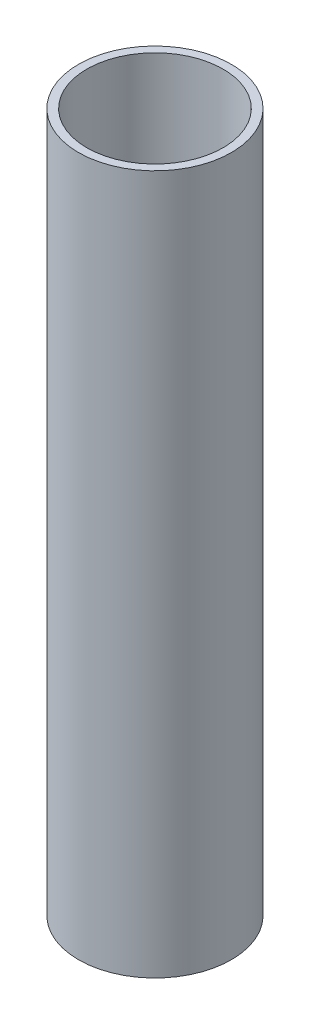
ISO-10303-21;
HEADER;
FILE_DESCRIPTION(('STEP AP214'),'2;1');
FILE_NAME('part.step','',(''),(''),'','','');
FILE_SCHEMA(('AUTOMOTIVE_DESIGN { 1 0 10303 214 1 1 1 1 }'));
ENDSEC;
DATA;
#1=APPLICATION_CONTEXT('core data for automotive mechanical design processes');
#2=APPLICATION_PROTOCOL_DEFINITION('international standard','automotive_design',2000,#1);
#3=PRODUCT_CONTEXT('',#1,'mechanical');
#4=PRODUCT('Part','Part','',(#3));
#5=PRODUCT_RELATED_PRODUCT_CATEGORY('part','',(#4));
#6=PRODUCT_DEFINITION_FORMATION('','',#4);
#7=PRODUCT_DEFINITION_CONTEXT('part definition',#1,'design');
#8=PRODUCT_DEFINITION('design','',#6,#7);
#9=PRODUCT_DEFINITION_SHAPE('','',#8);
#10=(LENGTH_UNIT() NAMED_UNIT(*) SI_UNIT(.MILLI.,.METRE.));
#11=(NAMED_UNIT(*) PLANE_ANGLE_UNIT() SI_UNIT($,.RADIAN.));
#12=(NAMED_UNIT(*) SI_UNIT($,.STERADIAN.) SOLID_ANGLE_UNIT());
#13=UNCERTAINTY_MEASURE_WITH_UNIT(LENGTH_MEASURE(1.E-05),#10,'distance_accuracy_value','');
#14=(GEOMETRIC_REPRESENTATION_CONTEXT(3) GLOBAL_UNCERTAINTY_ASSIGNED_CONTEXT((#13)) GLOBAL_UNIT_ASSIGNED_CONTEXT((#10,
#11,#12)) REPRESENTATION_CONTEXT('',''));
#15=CARTESIAN_POINT('',(0.,0.,0.));
#16=DIRECTION('',(0.,0.,1.));
#17=DIRECTION('',(1.,0.,0.));
#18=AXIS2_PLACEMENT_3D('',#15,#16,#17);
#19=CARTESIAN_POINT('',(0.,0.,0.));
#20=DIRECTION('',(0.,1.,0.));
#21=DIRECTION('',(0.,0.,1.));
#22=AXIS2_PLACEMENT_3D('',#19,#20,#21);
#23=CYLINDRICAL_SURFACE('',#22,19.812);
#24=CARTESIAN_POINT('',(0.,203.2,0.));
#25=DIRECTION('',(0.,1.,0.));
#26=DIRECTION('',(0.,0.,1.));
#27=AXIS2_PLACEMENT_3D('',#24,#25,#26);
#28=CIRCLE('',#27,19.812);
#29=CARTESIAN_POINT('',(0.,203.2,19.812));
#30=VERTEX_POINT('',#29);
#31=EDGE_CURVE('E17',#30,#30,#28,.F.);
#32=ORIENTED_EDGE('',*,*,#31,.F.);
#33=EDGE_LOOP('',(#32));
#34=FACE_BOUND('',#33,.T.);
#35=CARTESIAN_POINT('',(0.,0.,0.));
#36=DIRECTION('',(0.,1.,0.));
#37=DIRECTION('',(0.,0.,1.));
#38=AXIS2_PLACEMENT_3D('',#35,#36,#37);
#39=CIRCLE('',#38,19.812);
#40=CARTESIAN_POINT('',(0.,0.,19.812));
#41=VERTEX_POINT('',#40);
#42=EDGE_CURVE('E26',#41,#41,#39,.F.);
#43=ORIENTED_EDGE('',*,*,#42,.T.);
#44=EDGE_LOOP('',(#43));
#45=FACE_BOUND('',#44,.T.);
#46=ADVANCED_FACE('F14',(#34,#45),#23,.F.);
#47=CARTESIAN_POINT('',(0.,203.2,0.));
#48=DIRECTION('',(0.,1.,0.));
#49=DIRECTION('',(0.,0.,1.));
#50=AXIS2_PLACEMENT_3D('',#47,#48,#49);
#51=PLANE('',#50);
#52=ORIENTED_EDGE('',*,*,#31,.T.);
#53=EDGE_LOOP('',(#52));
#54=FACE_BOUND('',#53,.T.);
#55=CARTESIAN_POINT('',(0.,203.2,0.));
#56=DIRECTION('',(0.,1.,0.));
#57=DIRECTION('',(0.,0.,1.));
#58=AXIS2_PLACEMENT_3D('',#55,#56,#57);
#59=CIRCLE('',#58,22.225);
#60=CARTESIAN_POINT('',(0.,203.2,22.225));
#61=VERTEX_POINT('',#60);
#62=EDGE_CURVE('E21',#61,#61,#59,.F.);
#63=ORIENTED_EDGE('',*,*,#62,.F.);
#64=EDGE_LOOP('',(#63));
#65=FACE_BOUND('',#64,.T.);
#66=ADVANCED_FACE('F34',(#54,#65),#51,.T.);
#67=CARTESIAN_POINT('',(0.,0.,0.));
#68=DIRECTION('',(0.,1.,0.));
#69=DIRECTION('',(0.,0.,1.));
#70=AXIS2_PLACEMENT_3D('',#67,#68,#69);
#71=PLANE('',#70);
#72=ORIENTED_EDGE('',*,*,#42,.F.);
#73=EDGE_LOOP('',(#72));
#74=FACE_BOUND('',#73,.T.);
#75=CARTESIAN_POINT('',(0.,0.,0.));
#76=DIRECTION('',(0.,1.,0.));
#77=DIRECTION('',(0.,0.,1.));
#78=AXIS2_PLACEMENT_3D('',#75,#76,#77);
#79=CIRCLE('',#78,22.225);
#80=CARTESIAN_POINT('',(0.,0.,22.225));
#81=VERTEX_POINT('',#80);
#82=EDGE_CURVE('E10',#81,#81,#79,.T.);
#83=ORIENTED_EDGE('',*,*,#82,.F.);
#84=EDGE_LOOP('',(#83));
#85=FACE_BOUND('',#84,.T.);
#86=ADVANCED_FACE('F42',(#74,#85),#71,.F.);
#87=CARTESIAN_POINT('',(0.,0.,0.));
#88=DIRECTION('',(0.,1.,0.));
#89=DIRECTION('',(0.,0.,1.));
#90=AXIS2_PLACEMENT_3D('',#87,#88,#89);
#91=CYLINDRICAL_SURFACE('',#90,22.225);
#92=ORIENTED_EDGE('',*,*,#62,.T.);
#93=EDGE_LOOP('',(#92));
#94=FACE_BOUND('',#93,.T.);
#95=ORIENTED_EDGE('',*,*,#82,.T.);
#96=EDGE_LOOP('',(#95));
#97=FACE_BOUND('',#96,.T.);
#98=ADVANCED_FACE('F43',(#94,#97),#91,.T.);
#99=CLOSED_SHELL('',(#46,#66,#86,#98));
#100=MANIFOLD_SOLID_BREP('B1',#99);
#101=ADVANCED_BREP_SHAPE_REPRESENTATION('',(#18,#100),#14);
#102=SHAPE_DEFINITION_REPRESENTATION(#9,#101);
ENDSEC;
END-ISO-10303-21;
